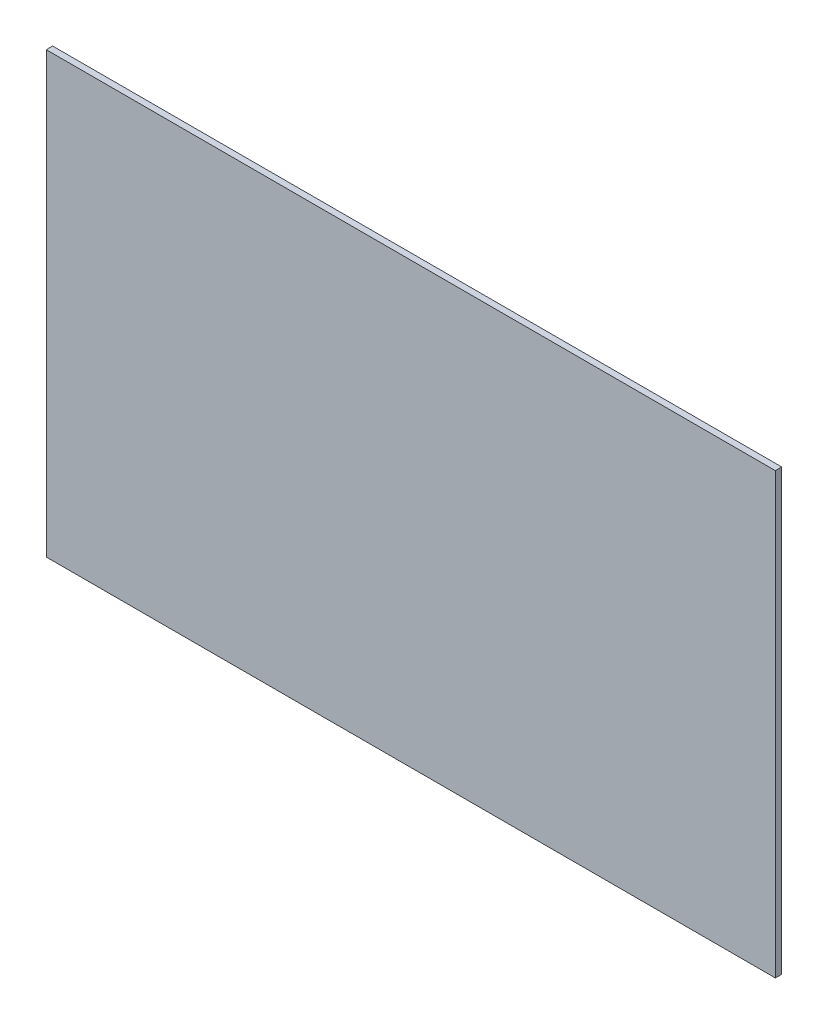
ISO-10303-21;
HEADER;
FILE_DESCRIPTION(('STEP AP214'),'2;1');
FILE_NAME('part.step','',(''),(''),'','','');
FILE_SCHEMA(('AUTOMOTIVE_DESIGN { 1 0 10303 214 1 1 1 1 }'));
ENDSEC;
DATA;
#1=APPLICATION_CONTEXT('core data for automotive mechanical design processes');
#2=APPLICATION_PROTOCOL_DEFINITION('international standard','automotive_design',2000,#1);
#3=PRODUCT_CONTEXT('',#1,'mechanical');
#4=PRODUCT('Part','Part','',(#3));
#5=PRODUCT_RELATED_PRODUCT_CATEGORY('part','',(#4));
#6=PRODUCT_DEFINITION_FORMATION('','',#4);
#7=PRODUCT_DEFINITION_CONTEXT('part definition',#1,'design');
#8=PRODUCT_DEFINITION('design','',#6,#7);
#9=PRODUCT_DEFINITION_SHAPE('','',#8);
#10=(LENGTH_UNIT() NAMED_UNIT(*) SI_UNIT(.MILLI.,.METRE.));
#11=(NAMED_UNIT(*) PLANE_ANGLE_UNIT() SI_UNIT($,.RADIAN.));
#12=(NAMED_UNIT(*) SI_UNIT($,.STERADIAN.) SOLID_ANGLE_UNIT());
#13=UNCERTAINTY_MEASURE_WITH_UNIT(LENGTH_MEASURE(1.E-05),#10,'distance_accuracy_value','');
#14=(GEOMETRIC_REPRESENTATION_CONTEXT(3) GLOBAL_UNCERTAINTY_ASSIGNED_CONTEXT((#13)) GLOBAL_UNIT_ASSIGNED_CONTEXT((#10,
#11,#12)) REPRESENTATION_CONTEXT('',''));
#15=CARTESIAN_POINT('',(0.,0.,0.));
#16=DIRECTION('',(0.,0.,1.));
#17=DIRECTION('',(1.,0.,0.));
#18=AXIS2_PLACEMENT_3D('',#15,#16,#17);
#19=CARTESIAN_POINT('',(-114.5,69.,2.));
#20=DIRECTION('',(1.,0.,0.));
#21=DIRECTION('',(0.,0.,-1.));
#22=AXIS2_PLACEMENT_3D('',#19,#20,#21);
#23=PLANE('',#22);
#24=DIRECTION('',(0.,-1.,0.));
#25=VECTOR('',#24,1.);
#26=CARTESIAN_POINT('',(-114.5,69.,0.));
#27=LINE('',#26,#25);
#28=CARTESIAN_POINT('',(-114.5,69.,0.));
#29=VERTEX_POINT('',#28);
#30=CARTESIAN_POINT('',(-114.5,-69.,0.));
#31=VERTEX_POINT('',#30);
#32=EDGE_CURVE('E98',#29,#31,#27,.T.);
#33=ORIENTED_EDGE('',*,*,#32,.T.);
#34=DIRECTION('',(0.,0.,-1.));
#35=VECTOR('',#34,1.);
#36=CARTESIAN_POINT('',(-114.5,-69.,2.));
#37=LINE('',#36,#35);
#38=CARTESIAN_POINT('',(-114.5,-69.,2.));
#39=VERTEX_POINT('',#38);
#40=EDGE_CURVE('E11',#39,#31,#37,.T.);
#41=ORIENTED_EDGE('',*,*,#40,.F.);
#42=DIRECTION('',(0.,-1.,0.));
#43=VECTOR('',#42,1.);
#44=CARTESIAN_POINT('',(-114.5,69.,2.));
#45=LINE('',#44,#43);
#46=CARTESIAN_POINT('',(-114.5,69.,2.));
#47=VERTEX_POINT('',#46);
#48=EDGE_CURVE('E86',#47,#39,#45,.T.);
#49=ORIENTED_EDGE('',*,*,#48,.F.);
#50=DIRECTION('',(0.,0.,-1.));
#51=VECTOR('',#50,1.);
#52=CARTESIAN_POINT('',(-114.5,69.,2.));
#53=LINE('',#52,#51);
#54=EDGE_CURVE('E94',#47,#29,#53,.T.);
#55=ORIENTED_EDGE('',*,*,#54,.T.);
#56=EDGE_LOOP('',(#33,#41,#49,#55));
#57=FACE_BOUND('',#56,.T.);
#58=ADVANCED_FACE('F35',(#57),#23,.F.);
#59=CARTESIAN_POINT('',(-114.5,-69.,2.));
#60=DIRECTION('',(0.,1.,0.));
#61=DIRECTION('',(0.,0.,1.));
#62=AXIS2_PLACEMENT_3D('',#59,#60,#61);
#63=PLANE('',#62);
#64=DIRECTION('',(1.,0.,0.));
#65=VECTOR('',#64,1.);
#66=CARTESIAN_POINT('',(-114.5,-69.,0.));
#67=LINE('',#66,#65);
#68=CARTESIAN_POINT('',(114.5,-69.,0.));
#69=VERTEX_POINT('',#68);
#70=EDGE_CURVE('E90',#31,#69,#67,.T.);
#71=ORIENTED_EDGE('',*,*,#70,.T.);
#72=DIRECTION('',(0.,0.,-1.));
#73=VECTOR('',#72,1.);
#74=CARTESIAN_POINT('',(114.5,-69.,2.));
#75=LINE('',#74,#73);
#76=CARTESIAN_POINT('',(114.5,-69.,2.));
#77=VERTEX_POINT('',#76);
#78=EDGE_CURVE('E43',#77,#69,#75,.T.);
#79=ORIENTED_EDGE('',*,*,#78,.F.);
#80=DIRECTION('',(1.,0.,0.));
#81=VECTOR('',#80,1.);
#82=CARTESIAN_POINT('',(-114.5,-69.,2.));
#83=LINE('',#82,#81);
#84=EDGE_CURVE('E81',#39,#77,#83,.T.);
#85=ORIENTED_EDGE('',*,*,#84,.F.);
#86=ORIENTED_EDGE('',*,*,#40,.T.);
#87=EDGE_LOOP('',(#71,#79,#85,#86));
#88=FACE_BOUND('',#87,.T.);
#89=ADVANCED_FACE('F89',(#88),#63,.F.);
#90=CARTESIAN_POINT('',(114.5,69.,2.));
#91=DIRECTION('',(-1.,0.,0.));
#92=DIRECTION('',(0.,0.,1.));
#93=AXIS2_PLACEMENT_3D('',#90,#91,#92);
#94=PLANE('',#93);
#95=DIRECTION('',(0.,1.,0.));
#96=VECTOR('',#95,1.);
#97=CARTESIAN_POINT('',(114.5,69.,0.));
#98=LINE('',#97,#96);
#99=CARTESIAN_POINT('',(114.5,69.,0.));
#100=VERTEX_POINT('',#99);
#101=EDGE_CURVE('E68',#69,#100,#98,.T.);
#102=ORIENTED_EDGE('',*,*,#101,.T.);
#103=DIRECTION('',(0.,0.,-1.));
#104=VECTOR('',#103,1.);
#105=CARTESIAN_POINT('',(114.5,69.,2.));
#106=LINE('',#105,#104);
#107=CARTESIAN_POINT('',(114.5,69.,2.));
#108=VERTEX_POINT('',#107);
#109=EDGE_CURVE('E91',#108,#100,#106,.T.);
#110=ORIENTED_EDGE('',*,*,#109,.F.);
#111=DIRECTION('',(0.,1.,0.));
#112=VECTOR('',#111,1.);
#113=CARTESIAN_POINT('',(114.5,69.,2.));
#114=LINE('',#113,#112);
#115=EDGE_CURVE('E84',#77,#108,#114,.T.);
#116=ORIENTED_EDGE('',*,*,#115,.F.);
#117=ORIENTED_EDGE('',*,*,#78,.T.);
#118=EDGE_LOOP('',(#102,#110,#116,#117));
#119=FACE_BOUND('',#118,.T.);
#120=ADVANCED_FACE('F92',(#119),#94,.F.);
#121=CARTESIAN_POINT('',(-114.5,69.,2.));
#122=DIRECTION('',(0.,-1.,0.));
#123=DIRECTION('',(0.,0.,-1.));
#124=AXIS2_PLACEMENT_3D('',#121,#122,#123);
#125=PLANE('',#124);
#126=DIRECTION('',(-1.,0.,0.));
#127=VECTOR('',#126,1.);
#128=CARTESIAN_POINT('',(-114.5,69.,0.));
#129=LINE('',#128,#127);
#130=EDGE_CURVE('E74',#100,#29,#129,.T.);
#131=ORIENTED_EDGE('',*,*,#130,.T.);
#132=ORIENTED_EDGE('',*,*,#54,.F.);
#133=DIRECTION('',(-1.,0.,0.));
#134=VECTOR('',#133,1.);
#135=CARTESIAN_POINT('',(-114.5,69.,2.));
#136=LINE('',#135,#134);
#137=EDGE_CURVE('E51',#108,#47,#136,.T.);
#138=ORIENTED_EDGE('',*,*,#137,.F.);
#139=ORIENTED_EDGE('',*,*,#109,.T.);
#140=EDGE_LOOP('',(#131,#132,#138,#139));
#141=FACE_BOUND('',#140,.T.);
#142=ADVANCED_FACE('F105',(#141),#125,.F.);
#143=CARTESIAN_POINT('',(0.,0.,2.));
#144=DIRECTION('',(0.,0.,1.));
#145=DIRECTION('',(1.,0.,0.));
#146=AXIS2_PLACEMENT_3D('',#143,#144,#145);
#147=PLANE('',#146);
#148=ORIENTED_EDGE('',*,*,#48,.T.);
#149=ORIENTED_EDGE('',*,*,#84,.T.);
#150=ORIENTED_EDGE('',*,*,#115,.T.);
#151=ORIENTED_EDGE('',*,*,#137,.T.);
#152=EDGE_LOOP('',(#148,#149,#150,#151));
#153=FACE_BOUND('',#152,.T.);
#154=ADVANCED_FACE('F82',(#153),#147,.T.);
#155=CARTESIAN_POINT('',(0.,0.,0.));
#156=DIRECTION('',(0.,0.,1.));
#157=DIRECTION('',(1.,0.,0.));
#158=AXIS2_PLACEMENT_3D('',#155,#156,#157);
#159=PLANE('',#158);
#160=ORIENTED_EDGE('',*,*,#32,.F.);
#161=ORIENTED_EDGE('',*,*,#130,.F.);
#162=ORIENTED_EDGE('',*,*,#101,.F.);
#163=ORIENTED_EDGE('',*,*,#70,.F.);
#164=EDGE_LOOP('',(#160,#161,#162,#163));
#165=FACE_BOUND('',#164,.T.);
#166=ADVANCED_FACE('F108',(#165),#159,.F.);
#167=CLOSED_SHELL('',(#58,#89,#120,#142,#154,#166));
#168=MANIFOLD_SOLID_BREP('B2',#167);
#169=ADVANCED_BREP_SHAPE_REPRESENTATION('',(#18,#168),#14);
#170=SHAPE_DEFINITION_REPRESENTATION(#9,#169);
ENDSEC;
END-ISO-10303-21;
